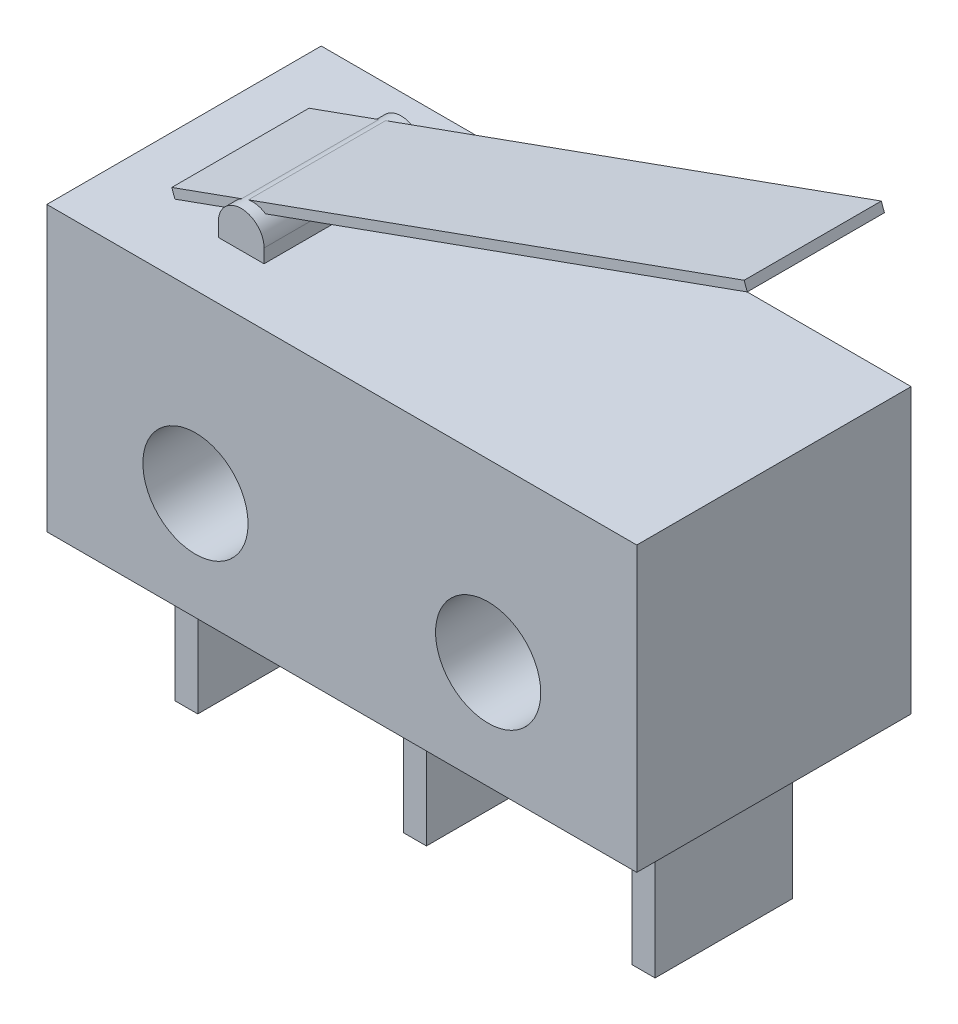
ISO-10303-21;
HEADER;
FILE_DESCRIPTION(('STEP AP214'),'2;1');
FILE_NAME('part.step','',(''),(''),'','','');
FILE_SCHEMA(('AUTOMOTIVE_DESIGN { 1 0 10303 214 1 1 1 1 }'));
ENDSEC;
DATA;
#1=APPLICATION_CONTEXT('core data for automotive mechanical design processes');
#2=APPLICATION_PROTOCOL_DEFINITION('international standard','automotive_design',2000,#1);
#3=PRODUCT_CONTEXT('',#1,'mechanical');
#4=PRODUCT('Part','Part','',(#3));
#5=PRODUCT_RELATED_PRODUCT_CATEGORY('part','',(#4));
#6=PRODUCT_DEFINITION_FORMATION('','',#4);
#7=PRODUCT_DEFINITION_CONTEXT('part definition',#1,'design');
#8=PRODUCT_DEFINITION('design','',#6,#7);
#9=PRODUCT_DEFINITION_SHAPE('','',#8);
#10=(LENGTH_UNIT() NAMED_UNIT(*) SI_UNIT(.MILLI.,.METRE.));
#11=(NAMED_UNIT(*) PLANE_ANGLE_UNIT() SI_UNIT($,.RADIAN.));
#12=(NAMED_UNIT(*) SI_UNIT($,.STERADIAN.) SOLID_ANGLE_UNIT());
#13=UNCERTAINTY_MEASURE_WITH_UNIT(LENGTH_MEASURE(1.E-05),#10,'distance_accuracy_value','');
#14=(GEOMETRIC_REPRESENTATION_CONTEXT(3) GLOBAL_UNCERTAINTY_ASSIGNED_CONTEXT((#13)) GLOBAL_UNIT_ASSIGNED_CONTEXT((#10,
#11,#12)) REPRESENTATION_CONTEXT('',''));
#15=CARTESIAN_POINT('',(0.,0.,0.));
#16=DIRECTION('',(0.,0.,1.));
#17=DIRECTION('',(1.,0.,0.));
#18=AXIS2_PLACEMENT_3D('',#15,#16,#17);
#19=CARTESIAN_POINT('',(-11.6,6.2,4.5));
#20=DIRECTION('',(0.941021825393203,0.338345864661656,0.));
#21=DIRECTION('',(-0.338345864661656,0.941021825393203,0.));
#22=AXIS2_PLACEMENT_3D('',#19,#20,#21);
#23=PLANE('',#22);
#24=DIRECTION('',(0.338345864661656,-0.941021825393203,0.));
#25=VECTOR('',#24,1.);
#26=CARTESIAN_POINT('',(-11.6,6.2,1.5));
#27=LINE('',#26,#25);
#28=CARTESIAN_POINT('',(-11.6676691729323,6.38820436507864,1.5));
#29=VERTEX_POINT('',#28);
#30=CARTESIAN_POINT('',(-11.6,6.2,1.5));
#31=VERTEX_POINT('',#30);
#32=EDGE_CURVE('E110',#29,#31,#27,.T.);
#33=ORIENTED_EDGE('',*,*,#32,.T.);
#34=DIRECTION('',(0.,0.,-1.));
#35=VECTOR('',#34,1.);
#36=CARTESIAN_POINT('',(-11.6,6.2,4.5));
#37=LINE('',#36,#35);
#38=CARTESIAN_POINT('',(-11.6,6.2,4.5));
#39=VERTEX_POINT('',#38);
#40=EDGE_CURVE('E12',#39,#31,#37,.T.);
#41=ORIENTED_EDGE('',*,*,#40,.F.);
#42=DIRECTION('',(0.338345864661656,-0.941021825393203,0.));
#43=VECTOR('',#42,1.);
#44=CARTESIAN_POINT('',(-11.6,6.2,4.5));
#45=LINE('',#44,#43);
#46=CARTESIAN_POINT('',(-11.6676691729323,6.38820436507864,4.5));
#47=VERTEX_POINT('',#46);
#48=EDGE_CURVE('E98',#47,#39,#45,.T.);
#49=ORIENTED_EDGE('',*,*,#48,.F.);
#50=DIRECTION('',(0.,0.,-1.));
#51=VECTOR('',#50,1.);
#52=CARTESIAN_POINT('',(-11.6676691729323,6.38820436507864,4.5));
#53=LINE('',#52,#51);
#54=EDGE_CURVE('E106',#47,#29,#53,.T.);
#55=ORIENTED_EDGE('',*,*,#54,.T.);
#56=EDGE_LOOP('',(#33,#41,#49,#55));
#57=FACE_BOUND('',#56,.T.);
#58=ADVANCED_FACE('F47',(#57),#23,.F.);
#59=CARTESIAN_POINT('',(-11.6,6.2,4.5));
#60=DIRECTION('',(-0.338345864661654,0.941021825393204,0.));
#61=DIRECTION('',(-0.941021825393204,-0.338345864661654,0.));
#62=AXIS2_PLACEMENT_3D('',#59,#60,#61);
#63=PLANE('',#62);
#64=DIRECTION('',(0.941021825393204,0.338345864661654,0.));
#65=VECTOR('',#64,1.);
#66=CARTESIAN_POINT('',(-11.6,6.2,1.5));
#67=LINE('',#66,#65);
#68=CARTESIAN_POINT('',(0.915590277729614,10.7,1.5));
#69=VERTEX_POINT('',#68);
#70=EDGE_CURVE('E102',#31,#69,#67,.T.);
#71=ORIENTED_EDGE('',*,*,#70,.T.);
#72=DIRECTION('',(0.,0.,-1.));
#73=VECTOR('',#72,1.);
#74=CARTESIAN_POINT('',(0.915590277729614,10.7,4.5));
#75=LINE('',#74,#73);
#76=CARTESIAN_POINT('',(0.915590277729614,10.7,4.5));
#77=VERTEX_POINT('',#76);
#78=EDGE_CURVE('E55',#77,#69,#75,.T.);
#79=ORIENTED_EDGE('',*,*,#78,.F.);
#80=DIRECTION('',(0.941021825393204,0.338345864661654,0.));
#81=VECTOR('',#80,1.);
#82=CARTESIAN_POINT('',(-11.6,6.2,4.5));
#83=LINE('',#82,#81);
#84=EDGE_CURVE('E93',#39,#77,#83,.T.);
#85=ORIENTED_EDGE('',*,*,#84,.F.);
#86=ORIENTED_EDGE('',*,*,#40,.T.);
#87=EDGE_LOOP('',(#71,#79,#85,#86));
#88=FACE_BOUND('',#87,.T.);
#89=ADVANCED_FACE('F101',(#88),#63,.F.);
#90=CARTESIAN_POINT('',(0.847921104797283,10.8882043650786,4.5));
#91=DIRECTION('',(-0.941021825393204,-0.338345864661655,0.));
#92=DIRECTION('',(0.338345864661655,-0.941021825393204,0.));
#93=AXIS2_PLACEMENT_3D('',#90,#91,#92);
#94=PLANE('',#93);
#95=DIRECTION('',(-0.338345864661655,0.941021825393204,0.));
#96=VECTOR('',#95,1.);
#97=CARTESIAN_POINT('',(0.847921104797283,10.8882043650786,1.5));
#98=LINE('',#97,#96);
#99=CARTESIAN_POINT('',(0.847921104797283,10.8882043650786,1.5));
#100=VERTEX_POINT('',#99);
#101=EDGE_CURVE('E80',#69,#100,#98,.T.);
#102=ORIENTED_EDGE('',*,*,#101,.T.);
#103=DIRECTION('',(0.,0.,-1.));
#104=VECTOR('',#103,1.);
#105=CARTESIAN_POINT('',(0.847921104797283,10.8882043650786,4.5));
#106=LINE('',#105,#104);
#107=CARTESIAN_POINT('',(0.847921104797283,10.8882043650786,4.5));
#108=VERTEX_POINT('',#107);
#109=EDGE_CURVE('E103',#108,#100,#106,.T.);
#110=ORIENTED_EDGE('',*,*,#109,.F.);
#111=DIRECTION('',(-0.338345864661655,0.941021825393204,0.));
#112=VECTOR('',#111,1.);
#113=CARTESIAN_POINT('',(0.847921104797283,10.8882043650786,4.5));
#114=LINE('',#113,#112);
#115=EDGE_CURVE('E96',#77,#108,#114,.T.);
#116=ORIENTED_EDGE('',*,*,#115,.F.);
#117=ORIENTED_EDGE('',*,*,#78,.T.);
#118=EDGE_LOOP('',(#102,#110,#116,#117));
#119=FACE_BOUND('',#118,.T.);
#120=ADVANCED_FACE('F104',(#119),#94,.F.);
#121=CARTESIAN_POINT('',(-11.6676691729323,6.38820436507864,4.5));
#122=DIRECTION('',(0.338345864661654,-0.941021825393204,0.));
#123=DIRECTION('',(0.941021825393204,0.338345864661654,0.));
#124=AXIS2_PLACEMENT_3D('',#121,#122,#123);
#125=PLANE('',#124);
#126=DIRECTION('',(-0.941021825393204,-0.338345864661654,0.));
#127=VECTOR('',#126,1.);
#128=CARTESIAN_POINT('',(-11.6676691729323,6.38820436507864,1.5));
#129=LINE('',#128,#127);
#130=EDGE_CURVE('E86',#100,#29,#129,.T.);
#131=ORIENTED_EDGE('',*,*,#130,.T.);
#132=ORIENTED_EDGE('',*,*,#54,.F.);
#133=DIRECTION('',(-0.941021825393204,-0.338345864661654,0.));
#134=VECTOR('',#133,1.);
#135=CARTESIAN_POINT('',(-11.6676691729323,6.38820436507864,4.5));
#136=LINE('',#135,#134);
#137=EDGE_CURVE('E63',#108,#47,#136,.T.);
#138=ORIENTED_EDGE('',*,*,#137,.F.);
#139=ORIENTED_EDGE('',*,*,#109,.T.);
#140=EDGE_LOOP('',(#131,#132,#138,#139));
#141=FACE_BOUND('',#140,.T.);
#142=ADVANCED_FACE('F117',(#141),#125,.F.);
#143=CARTESIAN_POINT('',(0.,0.,4.5));
#144=DIRECTION('',(0.,0.,-1.));
#145=DIRECTION('',(-1.,0.,0.));
#146=AXIS2_PLACEMENT_3D('',#143,#144,#145);
#147=PLANE('',#146);
#148=ORIENTED_EDGE('',*,*,#48,.T.);
#149=ORIENTED_EDGE('',*,*,#84,.T.);
#150=ORIENTED_EDGE('',*,*,#115,.T.);
#151=ORIENTED_EDGE('',*,*,#137,.T.);
#152=EDGE_LOOP('',(#148,#149,#150,#151));
#153=FACE_BOUND('',#152,.T.);
#154=ADVANCED_FACE('F94',(#153),#147,.F.);
#155=CARTESIAN_POINT('',(0.,0.,1.5));
#156=DIRECTION('',(0.,0.,-1.));
#157=DIRECTION('',(-1.,0.,0.));
#158=AXIS2_PLACEMENT_3D('',#155,#156,#157);
#159=PLANE('',#158);
#160=ORIENTED_EDGE('',*,*,#32,.F.);
#161=ORIENTED_EDGE('',*,*,#130,.F.);
#162=ORIENTED_EDGE('',*,*,#101,.F.);
#163=ORIENTED_EDGE('',*,*,#70,.F.);
#164=EDGE_LOOP('',(#160,#161,#162,#163));
#165=FACE_BOUND('',#164,.T.);
#166=ADVANCED_FACE('F120',(#165),#159,.T.);
#167=CLOSED_SHELL('',(#58,#89,#120,#142,#154,#166));
#168=MANIFOLD_SOLID_BREP('B2',#167);
#169=CARTESIAN_POINT('',(-12.9,0.,6.));
#170=DIRECTION('',(0.,1.,0.));
#171=DIRECTION('',(0.,0.,1.));
#172=AXIS2_PLACEMENT_3D('',#169,#170,#171);
#173=PLANE('',#172);
#174=DIRECTION('',(0.,0.,1.));
#175=VECTOR('',#174,1.);
#176=CARTESIAN_POINT('',(-6.1,0.,4.5));
#177=LINE('',#176,#175);
#178=CARTESIAN_POINT('',(-6.1,0.,1.5));
#179=VERTEX_POINT('',#178);
#180=CARTESIAN_POINT('',(-6.1,0.,4.5));
#181=VERTEX_POINT('',#180);
#182=EDGE_CURVE('E372',#179,#181,#177,.T.);
#183=ORIENTED_EDGE('',*,*,#182,.F.);
#184=DIRECTION('',(1.,0.,0.));
#185=VECTOR('',#184,1.);
#186=CARTESIAN_POINT('',(-6.1,0.,1.5));
#187=LINE('',#186,#185);
#188=CARTESIAN_POINT('',(-6.6,0.,1.5));
#189=VERTEX_POINT('',#188);
#190=EDGE_CURVE('E362',#189,#179,#187,.T.);
#191=ORIENTED_EDGE('',*,*,#190,.F.);
#192=DIRECTION('',(0.,0.,-1.));
#193=VECTOR('',#192,1.);
#194=CARTESIAN_POINT('',(-6.6,0.,4.5));
#195=LINE('',#194,#193);
#196=CARTESIAN_POINT('',(-6.6,0.,4.5));
#197=VERTEX_POINT('',#196);
#198=EDGE_CURVE('E365',#197,#189,#195,.T.);
#199=ORIENTED_EDGE('',*,*,#198,.F.);
#200=DIRECTION('',(-1.,0.,0.));
#201=VECTOR('',#200,1.);
#202=CARTESIAN_POINT('',(-6.1,0.,4.5));
#203=LINE('',#202,#201);
#204=EDGE_CURVE('E369',#181,#197,#203,.T.);
#205=ORIENTED_EDGE('',*,*,#204,.F.);
#206=EDGE_LOOP('',(#183,#191,#199,#205));
#207=FACE_BOUND('',#206,.T.);
#208=DIRECTION('',(1.,0.,0.));
#209=VECTOR('',#208,1.);
#210=CARTESIAN_POINT('',(-12.9,0.,0.));
#211=LINE('',#210,#209);
#212=CARTESIAN_POINT('',(-12.9,0.,0.));
#213=VERTEX_POINT('',#212);
#214=CARTESIAN_POINT('',(0.,0.,0.));
#215=VERTEX_POINT('',#214);
#216=EDGE_CURVE('E457',#213,#215,#211,.T.);
#217=ORIENTED_EDGE('',*,*,#216,.T.);
#218=DIRECTION('',(0.,0.,-1.));
#219=VECTOR('',#218,1.);
#220=CARTESIAN_POINT('',(0.,0.,6.));
#221=LINE('',#220,#219);
#222=CARTESIAN_POINT('',(0.,0.,6.));
#223=VERTEX_POINT('',#222);
#224=EDGE_CURVE('E45',#223,#215,#221,.T.);
#225=ORIENTED_EDGE('',*,*,#224,.F.);
#226=DIRECTION('',(1.,0.,0.));
#227=VECTOR('',#226,1.);
#228=CARTESIAN_POINT('',(-12.9,0.,6.));
#229=LINE('',#228,#227);
#230=CARTESIAN_POINT('',(-12.9,0.,6.));
#231=VERTEX_POINT('',#230);
#232=EDGE_CURVE('E458',#231,#223,#229,.T.);
#233=ORIENTED_EDGE('',*,*,#232,.F.);
#234=DIRECTION('',(0.,0.,-1.));
#235=VECTOR('',#234,1.);
#236=CARTESIAN_POINT('',(-12.9,0.,6.));
#237=LINE('',#236,#235);
#238=EDGE_CURVE('E468',#231,#213,#237,.T.);
#239=ORIENTED_EDGE('',*,*,#238,.T.);
#240=EDGE_LOOP('',(#217,#225,#233,#239));
#241=FACE_BOUND('',#240,.T.);
#242=DIRECTION('',(0.,0.,1.));
#243=VECTOR('',#242,1.);
#244=CARTESIAN_POINT('',(-1.1,0.,4.5));
#245=LINE('',#244,#243);
#246=CARTESIAN_POINT('',(-1.1,0.,1.5));
#247=VERTEX_POINT('',#246);
#248=CARTESIAN_POINT('',(-1.1,0.,4.5));
#249=VERTEX_POINT('',#248);
#250=EDGE_CURVE('E375',#247,#249,#245,.T.);
#251=ORIENTED_EDGE('',*,*,#250,.F.);
#252=DIRECTION('',(1.,0.,0.));
#253=VECTOR('',#252,1.);
#254=CARTESIAN_POINT('',(-1.1,0.,1.5));
#255=LINE('',#254,#253);
#256=CARTESIAN_POINT('',(-1.6,0.,1.5));
#257=VERTEX_POINT('',#256);
#258=EDGE_CURVE('E387',#257,#247,#255,.T.);
#259=ORIENTED_EDGE('',*,*,#258,.F.);
#260=DIRECTION('',(0.,0.,-1.));
#261=VECTOR('',#260,1.);
#262=CARTESIAN_POINT('',(-1.6,0.,4.5));
#263=LINE('',#262,#261);
#264=CARTESIAN_POINT('',(-1.6,0.,4.5));
#265=VERTEX_POINT('',#264);
#266=EDGE_CURVE('E399',#265,#257,#263,.T.);
#267=ORIENTED_EDGE('',*,*,#266,.F.);
#268=DIRECTION('',(-1.,0.,0.));
#269=VECTOR('',#268,1.);
#270=CARTESIAN_POINT('',(-1.1,0.,4.5));
#271=LINE('',#270,#269);
#272=EDGE_CURVE('E396',#249,#265,#271,.T.);
#273=ORIENTED_EDGE('',*,*,#272,.F.);
#274=EDGE_LOOP('',(#251,#259,#267,#273));
#275=FACE_BOUND('',#274,.T.);
#276=DIRECTION('',(0.,0.,1.));
#277=VECTOR('',#276,1.);
#278=CARTESIAN_POINT('',(-11.1,0.,4.5));
#279=LINE('',#278,#277);
#280=CARTESIAN_POINT('',(-11.1,0.,1.5));
#281=VERTEX_POINT('',#280);
#282=CARTESIAN_POINT('',(-11.1,0.,4.5));
#283=VERTEX_POINT('',#282);
#284=EDGE_CURVE('E315',#281,#283,#279,.T.);
#285=ORIENTED_EDGE('',*,*,#284,.F.);
#286=DIRECTION('',(1.,0.,0.));
#287=VECTOR('',#286,1.);
#288=CARTESIAN_POINT('',(-11.1,0.,1.5));
#289=LINE('',#288,#287);
#290=CARTESIAN_POINT('',(-11.6,0.,1.5));
#291=VERTEX_POINT('',#290);
#292=EDGE_CURVE('E317',#291,#281,#289,.T.);
#293=ORIENTED_EDGE('',*,*,#292,.F.);
#294=DIRECTION('',(0.,0.,-1.));
#295=VECTOR('',#294,1.);
#296=CARTESIAN_POINT('',(-11.6,0.,4.5));
#297=LINE('',#296,#295);
#298=CARTESIAN_POINT('',(-11.6,0.,4.5));
#299=VERTEX_POINT('',#298);
#300=EDGE_CURVE('E202',#299,#291,#297,.T.);
#301=ORIENTED_EDGE('',*,*,#300,.F.);
#302=DIRECTION('',(-1.,0.,0.));
#303=VECTOR('',#302,1.);
#304=CARTESIAN_POINT('',(-11.1,0.,4.5));
#305=LINE('',#304,#303);
#306=EDGE_CURVE('E197',#283,#299,#305,.T.);
#307=ORIENTED_EDGE('',*,*,#306,.F.);
#308=EDGE_LOOP('',(#285,#293,#301,#307));
#309=FACE_BOUND('',#308,.T.);
#310=ADVANCED_FACE('F183',(#207,#241,#275,#309),#173,.F.);
#311=CARTESIAN_POINT('',(0.,0.,6.));
#312=DIRECTION('',(-1.,0.,0.));
#313=DIRECTION('',(0.,0.,1.));
#314=AXIS2_PLACEMENT_3D('',#311,#312,#313);
#315=PLANE('',#314);
#316=DIRECTION('',(0.,1.,0.));
#317=VECTOR('',#316,1.);
#318=CARTESIAN_POINT('',(0.,0.,0.));
#319=LINE('',#318,#317);
#320=CARTESIAN_POINT('',(0.,6.2,0.));
#321=VERTEX_POINT('',#320);
#322=EDGE_CURVE('E471',#215,#321,#319,.T.);
#323=ORIENTED_EDGE('',*,*,#322,.T.);
#324=DIRECTION('',(0.,0.,-1.));
#325=VECTOR('',#324,1.);
#326=CARTESIAN_POINT('',(0.,6.2,6.));
#327=LINE('',#326,#325);
#328=CARTESIAN_POINT('',(0.,6.2,6.));
#329=VERTEX_POINT('',#328);
#330=EDGE_CURVE('E190',#329,#321,#327,.T.);
#331=ORIENTED_EDGE('',*,*,#330,.F.);
#332=DIRECTION('',(0.,1.,0.));
#333=VECTOR('',#332,1.);
#334=CARTESIAN_POINT('',(0.,0.,6.));
#335=LINE('',#334,#333);
#336=EDGE_CURVE('E461',#223,#329,#335,.T.);
#337=ORIENTED_EDGE('',*,*,#336,.F.);
#338=ORIENTED_EDGE('',*,*,#224,.T.);
#339=EDGE_LOOP('',(#323,#331,#337,#338));
#340=FACE_BOUND('',#339,.T.);
#341=ADVANCED_FACE('F502',(#340),#315,.F.);
#342=CARTESIAN_POINT('',(-12.9,6.2,6.));
#343=DIRECTION('',(0.,-1.,0.));
#344=DIRECTION('',(0.,0.,-1.));
#345=AXIS2_PLACEMENT_3D('',#342,#343,#344);
#346=PLANE('',#345);
#347=DIRECTION('',(0.,0.,-1.));
#348=VECTOR('',#347,1.);
#349=CARTESIAN_POINT('',(-9.4,6.2,4.75));
#350=LINE('',#349,#348);
#351=CARTESIAN_POINT('',(-9.4,6.2,4.75));
#352=VERTEX_POINT('',#351);
#353=CARTESIAN_POINT('',(-9.4,6.2,1.25));
#354=VERTEX_POINT('',#353);
#355=EDGE_CURVE('E452',#352,#354,#350,.T.);
#356=ORIENTED_EDGE('',*,*,#355,.F.);
#357=DIRECTION('',(1.,0.,0.));
#358=VECTOR('',#357,1.);
#359=CARTESIAN_POINT('',(-10.4,6.2,4.75));
#360=LINE('',#359,#358);
#361=CARTESIAN_POINT('',(-10.4,6.2,4.75));
#362=VERTEX_POINT('',#361);
#363=EDGE_CURVE('E431',#362,#352,#360,.T.);
#364=ORIENTED_EDGE('',*,*,#363,.F.);
#365=DIRECTION('',(0.,0.,-1.));
#366=VECTOR('',#365,1.);
#367=CARTESIAN_POINT('',(-10.4,6.2,4.75));
#368=LINE('',#367,#366);
#369=CARTESIAN_POINT('',(-10.4,6.2,1.25));
#370=VERTEX_POINT('',#369);
#371=EDGE_CURVE('E455',#362,#370,#368,.T.);
#372=ORIENTED_EDGE('',*,*,#371,.T.);
#373=DIRECTION('',(1.,0.,0.));
#374=VECTOR('',#373,1.);
#375=CARTESIAN_POINT('',(-10.4,6.2,1.25));
#376=LINE('',#375,#374);
#377=EDGE_CURVE('E442',#370,#354,#376,.T.);
#378=ORIENTED_EDGE('',*,*,#377,.T.);
#379=EDGE_LOOP('',(#356,#364,#372,#378));
#380=FACE_BOUND('',#379,.T.);
#381=DIRECTION('',(-1.,0.,0.));
#382=VECTOR('',#381,1.);
#383=CARTESIAN_POINT('',(-12.9,6.2,0.));
#384=LINE('',#383,#382);
#385=CARTESIAN_POINT('',(-12.9,6.2,0.));
#386=VERTEX_POINT('',#385);
#387=EDGE_CURVE('E473',#321,#386,#384,.T.);
#388=ORIENTED_EDGE('',*,*,#387,.T.);
#389=DIRECTION('',(0.,0.,-1.));
#390=VECTOR('',#389,1.);
#391=CARTESIAN_POINT('',(-12.9,6.2,6.));
#392=LINE('',#391,#390);
#393=CARTESIAN_POINT('',(-12.9,6.2,6.));
#394=VERTEX_POINT('',#393);
#395=EDGE_CURVE('E478',#394,#386,#392,.T.);
#396=ORIENTED_EDGE('',*,*,#395,.F.);
#397=DIRECTION('',(-1.,0.,0.));
#398=VECTOR('',#397,1.);
#399=CARTESIAN_POINT('',(-12.9,6.2,6.));
#400=LINE('',#399,#398);
#401=EDGE_CURVE('E464',#329,#394,#400,.T.);
#402=ORIENTED_EDGE('',*,*,#401,.F.);
#403=ORIENTED_EDGE('',*,*,#330,.T.);
#404=EDGE_LOOP('',(#388,#396,#402,#403));
#405=FACE_BOUND('',#404,.T.);
#406=ADVANCED_FACE('F485',(#380,#405),#346,.F.);
#407=CARTESIAN_POINT('',(-12.9,6.2,6.));
#408=DIRECTION('',(1.,0.,0.));
#409=DIRECTION('',(0.,0.,-1.));
#410=AXIS2_PLACEMENT_3D('',#407,#408,#409);
#411=PLANE('',#410);
#412=DIRECTION('',(0.,-1.,0.));
#413=VECTOR('',#412,1.);
#414=CARTESIAN_POINT('',(-12.9,6.2,0.));
#415=LINE('',#414,#413);
#416=EDGE_CURVE('E462',#386,#213,#415,.T.);
#417=ORIENTED_EDGE('',*,*,#416,.T.);
#418=ORIENTED_EDGE('',*,*,#238,.F.);
#419=DIRECTION('',(0.,-1.,0.));
#420=VECTOR('',#419,1.);
#421=CARTESIAN_POINT('',(-12.9,6.2,6.));
#422=LINE('',#421,#420);
#423=EDGE_CURVE('E466',#394,#231,#422,.T.);
#424=ORIENTED_EDGE('',*,*,#423,.F.);
#425=ORIENTED_EDGE('',*,*,#395,.T.);
#426=EDGE_LOOP('',(#417,#418,#424,#425));
#427=FACE_BOUND('',#426,.T.);
#428=ADVANCED_FACE('F494',(#427),#411,.F.);
#429=CARTESIAN_POINT('',(0.,0.,6.));
#430=DIRECTION('',(0.,0.,1.));
#431=DIRECTION('',(1.,0.,0.));
#432=AXIS2_PLACEMENT_3D('',#429,#430,#431);
#433=PLANE('',#432);
#434=CARTESIAN_POINT('',(-3.25,2.35,6.));
#435=DIRECTION('',(0.,0.,1.));
#436=DIRECTION('',(1.,0.,0.));
#437=AXIS2_PLACEMENT_3D('',#434,#435,#436);
#438=CIRCLE('',#437,1.15);
#439=CARTESIAN_POINT('',(-2.1,2.35,6.));
#440=VERTEX_POINT('',#439);
#441=EDGE_CURVE('E416',#440,#440,#438,.T.);
#442=ORIENTED_EDGE('',*,*,#441,.F.);
#443=EDGE_LOOP('',(#442));
#444=FACE_BOUND('',#443,.T.);
#445=CARTESIAN_POINT('',(-9.65,2.35,6.));
#446=DIRECTION('',(0.,0.,1.));
#447=DIRECTION('',(1.,0.,0.));
#448=AXIS2_PLACEMENT_3D('',#445,#446,#447);
#449=CIRCLE('',#448,1.15);
#450=CARTESIAN_POINT('',(-8.5,2.35,6.));
#451=VERTEX_POINT('',#450);
#452=EDGE_CURVE('E420',#451,#451,#449,.T.);
#453=ORIENTED_EDGE('',*,*,#452,.F.);
#454=EDGE_LOOP('',(#453));
#455=FACE_BOUND('',#454,.T.);
#456=ORIENTED_EDGE('',*,*,#232,.T.);
#457=ORIENTED_EDGE('',*,*,#336,.T.);
#458=ORIENTED_EDGE('',*,*,#401,.T.);
#459=ORIENTED_EDGE('',*,*,#423,.T.);
#460=EDGE_LOOP('',(#456,#457,#458,#459));
#461=FACE_BOUND('',#460,.T.);
#462=ADVANCED_FACE('F501',(#444,#455,#461),#433,.T.);
#463=CARTESIAN_POINT('',(0.,0.,0.));
#464=DIRECTION('',(0.,0.,1.));
#465=DIRECTION('',(1.,0.,0.));
#466=AXIS2_PLACEMENT_3D('',#463,#464,#465);
#467=PLANE('',#466);
#468=CARTESIAN_POINT('',(-3.25,2.35,0.));
#469=DIRECTION('',(0.,0.,1.));
#470=DIRECTION('',(1.,0.,0.));
#471=AXIS2_PLACEMENT_3D('',#468,#469,#470);
#472=CIRCLE('',#471,1.15);
#473=CARTESIAN_POINT('',(-2.1,2.35,0.));
#474=VERTEX_POINT('',#473);
#475=EDGE_CURVE('E419',#474,#474,#472,.T.);
#476=ORIENTED_EDGE('',*,*,#475,.T.);
#477=EDGE_LOOP('',(#476));
#478=FACE_BOUND('',#477,.T.);
#479=CARTESIAN_POINT('',(-9.65,2.35,0.));
#480=DIRECTION('',(0.,0.,1.));
#481=DIRECTION('',(1.,0.,0.));
#482=AXIS2_PLACEMENT_3D('',#479,#480,#481);
#483=CIRCLE('',#482,1.15);
#484=CARTESIAN_POINT('',(-8.5,2.35,0.));
#485=VERTEX_POINT('',#484);
#486=EDGE_CURVE('E415',#485,#485,#483,.T.);
#487=ORIENTED_EDGE('',*,*,#486,.T.);
#488=EDGE_LOOP('',(#487));
#489=FACE_BOUND('',#488,.T.);
#490=ORIENTED_EDGE('',*,*,#216,.F.);
#491=ORIENTED_EDGE('',*,*,#416,.F.);
#492=ORIENTED_EDGE('',*,*,#387,.F.);
#493=ORIENTED_EDGE('',*,*,#322,.F.);
#494=EDGE_LOOP('',(#490,#491,#492,#493));
#495=FACE_BOUND('',#494,.T.);
#496=ADVANCED_FACE('F491',(#478,#489,#495),#467,.F.);
#497=CARTESIAN_POINT('',(-10.4,6.2,4.75));
#498=DIRECTION('',(1.,0.,0.));
#499=DIRECTION('',(0.,0.,-1.));
#500=AXIS2_PLACEMENT_3D('',#497,#498,#499);
#501=PLANE('',#500);
#502=DIRECTION('',(0.,-1.,0.));
#503=VECTOR('',#502,1.);
#504=CARTESIAN_POINT('',(-10.4,6.2,1.25));
#505=LINE('',#504,#503);
#506=CARTESIAN_POINT('',(-10.4,6.5,1.25));
#507=VERTEX_POINT('',#506);
#508=EDGE_CURVE('E423',#507,#370,#505,.T.);
#509=ORIENTED_EDGE('',*,*,#508,.T.);
#510=ORIENTED_EDGE('',*,*,#371,.F.);
#511=DIRECTION('',(0.,-1.,0.));
#512=VECTOR('',#511,1.);
#513=CARTESIAN_POINT('',(-10.4,6.2,4.75));
#514=LINE('',#513,#512);
#515=CARTESIAN_POINT('',(-10.4,6.5,4.75));
#516=VERTEX_POINT('',#515);
#517=EDGE_CURVE('E428',#516,#362,#514,.T.);
#518=ORIENTED_EDGE('',*,*,#517,.F.);
#519=DIRECTION('',(0.,0.,-1.));
#520=VECTOR('',#519,1.);
#521=CARTESIAN_POINT('',(-10.4,6.5,4.75));
#522=LINE('',#521,#520);
#523=EDGE_CURVE('E439',#516,#507,#522,.T.);
#524=ORIENTED_EDGE('',*,*,#523,.T.);
#525=EDGE_LOOP('',(#509,#510,#518,#524));
#526=FACE_BOUND('',#525,.T.);
#527=ADVANCED_FACE('F516',(#526),#501,.F.);
#528=CARTESIAN_POINT('',(-9.4,6.5,4.75));
#529=DIRECTION('',(-1.,0.,0.));
#530=DIRECTION('',(0.,-1.,0.));
#531=AXIS2_PLACEMENT_3D('',#528,#529,#530);
#532=PLANE('',#531);
#533=DIRECTION('',(0.,1.,0.));
#534=VECTOR('',#533,1.);
#535=CARTESIAN_POINT('',(-9.4,6.5,1.25));
#536=LINE('',#535,#534);
#537=CARTESIAN_POINT('',(-9.4,6.5,1.25));
#538=VERTEX_POINT('',#537);
#539=EDGE_CURVE('E444',#354,#538,#536,.T.);
#540=ORIENTED_EDGE('',*,*,#539,.T.);
#541=DIRECTION('',(0.,0.,-1.));
#542=VECTOR('',#541,1.);
#543=CARTESIAN_POINT('',(-9.4,6.5,4.75));
#544=LINE('',#543,#542);
#545=CARTESIAN_POINT('',(-9.4,6.5,4.75));
#546=VERTEX_POINT('',#545);
#547=EDGE_CURVE('E449',#546,#538,#544,.T.);
#548=ORIENTED_EDGE('',*,*,#547,.F.);
#549=DIRECTION('',(0.,1.,0.));
#550=VECTOR('',#549,1.);
#551=CARTESIAN_POINT('',(-9.4,6.5,4.75));
#552=LINE('',#551,#550);
#553=EDGE_CURVE('E435',#352,#546,#552,.T.);
#554=ORIENTED_EDGE('',*,*,#553,.F.);
#555=ORIENTED_EDGE('',*,*,#355,.T.);
#556=EDGE_LOOP('',(#540,#548,#554,#555));
#557=FACE_BOUND('',#556,.T.);
#558=ADVANCED_FACE('F523',(#557),#532,.F.);
#559=CARTESIAN_POINT('',(-9.9,6.5,4.75));
#560=DIRECTION('',(0.,0.,-1.));
#561=DIRECTION('',(-1.,0.,0.));
#562=AXIS2_PLACEMENT_3D('',#559,#560,#561);
#563=CYLINDRICAL_SURFACE('',#562,0.5);
#564=CARTESIAN_POINT('',(-9.9,6.5,1.25));
#565=DIRECTION('',(0.,0.,1.));
#566=DIRECTION('',(1.,0.,0.));
#567=AXIS2_PLACEMENT_3D('',#564,#565,#566);
#568=CIRCLE('',#567,0.5);
#569=EDGE_CURVE('E432',#538,#507,#568,.T.);
#570=ORIENTED_EDGE('',*,*,#569,.T.);
#571=ORIENTED_EDGE('',*,*,#523,.F.);
#572=CARTESIAN_POINT('',(-9.9,6.5,4.75));
#573=DIRECTION('',(0.,0.,1.));
#574=DIRECTION('',(1.,0.,0.));
#575=AXIS2_PLACEMENT_3D('',#572,#573,#574);
#576=CIRCLE('',#575,0.5);
#577=EDGE_CURVE('E437',#546,#516,#576,.T.);
#578=ORIENTED_EDGE('',*,*,#577,.F.);
#579=ORIENTED_EDGE('',*,*,#547,.T.);
#580=EDGE_LOOP('',(#570,#571,#578,#579));
#581=FACE_BOUND('',#580,.T.);
#582=ADVANCED_FACE('F527',(#581),#563,.T.);
#583=CARTESIAN_POINT('',(-9.9,6.5,4.75));
#584=DIRECTION('',(0.,0.,1.));
#585=DIRECTION('',(1.,0.,0.));
#586=AXIS2_PLACEMENT_3D('',#583,#584,#585);
#587=PLANE('',#586);
#588=ORIENTED_EDGE('',*,*,#517,.T.);
#589=ORIENTED_EDGE('',*,*,#363,.T.);
#590=ORIENTED_EDGE('',*,*,#553,.T.);
#591=ORIENTED_EDGE('',*,*,#577,.T.);
#592=EDGE_LOOP('',(#588,#589,#590,#591));
#593=FACE_BOUND('',#592,.T.);
#594=ADVANCED_FACE('F531',(#593),#587,.T.);
#595=CARTESIAN_POINT('',(-9.9,6.5,1.25));
#596=DIRECTION('',(0.,0.,1.));
#597=DIRECTION('',(1.,0.,0.));
#598=AXIS2_PLACEMENT_3D('',#595,#596,#597);
#599=PLANE('',#598);
#600=ORIENTED_EDGE('',*,*,#508,.F.);
#601=ORIENTED_EDGE('',*,*,#569,.F.);
#602=ORIENTED_EDGE('',*,*,#539,.F.);
#603=ORIENTED_EDGE('',*,*,#377,.F.);
#604=EDGE_LOOP('',(#600,#601,#602,#603));
#605=FACE_BOUND('',#604,.T.);
#606=ADVANCED_FACE('F533',(#605),#599,.F.);
#607=CARTESIAN_POINT('',(-9.65,2.35,0.));
#608=DIRECTION('',(0.,0.,1.));
#609=DIRECTION('',(1.,0.,0.));
#610=AXIS2_PLACEMENT_3D('',#607,#608,#609);
#611=CYLINDRICAL_SURFACE('',#610,1.15);
#612=ORIENTED_EDGE('',*,*,#486,.F.);
#613=EDGE_LOOP('',(#612));
#614=FACE_BOUND('',#613,.T.);
#615=ORIENTED_EDGE('',*,*,#452,.T.);
#616=EDGE_LOOP('',(#615));
#617=FACE_BOUND('',#616,.T.);
#618=ADVANCED_FACE('F536',(#614,#617),#611,.F.);
#619=CARTESIAN_POINT('',(-3.25,2.35,0.));
#620=DIRECTION('',(0.,0.,1.));
#621=DIRECTION('',(1.,0.,0.));
#622=AXIS2_PLACEMENT_3D('',#619,#620,#621);
#623=CYLINDRICAL_SURFACE('',#622,1.15);
#624=ORIENTED_EDGE('',*,*,#475,.F.);
#625=EDGE_LOOP('',(#624));
#626=FACE_BOUND('',#625,.T.);
#627=ORIENTED_EDGE('',*,*,#441,.T.);
#628=EDGE_LOOP('',(#627));
#629=FACE_BOUND('',#628,.T.);
#630=ADVANCED_FACE('F543',(#626,#629),#623,.F.);
#631=CARTESIAN_POINT('',(-1.1,-3.3,4.5));
#632=DIRECTION('',(-1.,0.,0.));
#633=DIRECTION('',(0.,0.,1.));
#634=AXIS2_PLACEMENT_3D('',#631,#632,#633);
#635=PLANE('',#634);
#636=ORIENTED_EDGE('',*,*,#250,.T.);
#637=DIRECTION('',(0.,1.,0.));
#638=VECTOR('',#637,1.);
#639=CARTESIAN_POINT('',(-1.1,-3.3,4.5));
#640=LINE('',#639,#638);
#641=CARTESIAN_POINT('',(-1.1,-3.3,4.5));
#642=VERTEX_POINT('',#641);
#643=EDGE_CURVE('E412',#642,#249,#640,.T.);
#644=ORIENTED_EDGE('',*,*,#643,.F.);
#645=DIRECTION('',(0.,0.,1.));
#646=VECTOR('',#645,1.);
#647=CARTESIAN_POINT('',(-1.1,-3.3,4.5));
#648=LINE('',#647,#646);
#649=CARTESIAN_POINT('',(-1.1,-3.3,1.5));
#650=VERTEX_POINT('',#649);
#651=EDGE_CURVE('E383',#650,#642,#648,.T.);
#652=ORIENTED_EDGE('',*,*,#651,.F.);
#653=DIRECTION('',(0.,1.,0.));
#654=VECTOR('',#653,1.);
#655=CARTESIAN_POINT('',(-1.1,-3.3,1.5));
#656=LINE('',#655,#654);
#657=EDGE_CURVE('E393',#650,#247,#656,.T.);
#658=ORIENTED_EDGE('',*,*,#657,.T.);
#659=EDGE_LOOP('',(#636,#644,#652,#658));
#660=FACE_BOUND('',#659,.T.);
#661=ADVANCED_FACE('F547',(#660),#635,.F.);
#662=CARTESIAN_POINT('',(-1.1,-3.3,4.5));
#663=DIRECTION('',(0.,0.,-1.));
#664=DIRECTION('',(-1.,0.,0.));
#665=AXIS2_PLACEMENT_3D('',#662,#663,#664);
#666=PLANE('',#665);
#667=ORIENTED_EDGE('',*,*,#272,.T.);
#668=DIRECTION('',(0.,1.,0.));
#669=VECTOR('',#668,1.);
#670=CARTESIAN_POINT('',(-1.6,-3.3,4.5));
#671=LINE('',#670,#669);
#672=CARTESIAN_POINT('',(-1.6,-3.3,4.5));
#673=VERTEX_POINT('',#672);
#674=EDGE_CURVE('E409',#673,#265,#671,.T.);
#675=ORIENTED_EDGE('',*,*,#674,.F.);
#676=DIRECTION('',(-1.,0.,0.));
#677=VECTOR('',#676,1.);
#678=CARTESIAN_POINT('',(-1.1,-3.3,4.5));
#679=LINE('',#678,#677);
#680=EDGE_CURVE('E386',#642,#673,#679,.T.);
#681=ORIENTED_EDGE('',*,*,#680,.F.);
#682=ORIENTED_EDGE('',*,*,#643,.T.);
#683=EDGE_LOOP('',(#667,#675,#681,#682));
#684=FACE_BOUND('',#683,.T.);
#685=ADVANCED_FACE('F551',(#684),#666,.F.);
#686=CARTESIAN_POINT('',(-1.6,-3.3,4.5));
#687=DIRECTION('',(1.,0.,0.));
#688=DIRECTION('',(0.,0.,-1.));
#689=AXIS2_PLACEMENT_3D('',#686,#687,#688);
#690=PLANE('',#689);
#691=ORIENTED_EDGE('',*,*,#266,.T.);
#692=DIRECTION('',(0.,1.,0.));
#693=VECTOR('',#692,1.);
#694=CARTESIAN_POINT('',(-1.6,-3.3,1.5));
#695=LINE('',#694,#693);
#696=CARTESIAN_POINT('',(-1.6,-3.3,1.5));
#697=VERTEX_POINT('',#696);
#698=EDGE_CURVE('E406',#697,#257,#695,.T.);
#699=ORIENTED_EDGE('',*,*,#698,.F.);
#700=DIRECTION('',(0.,0.,-1.));
#701=VECTOR('',#700,1.);
#702=CARTESIAN_POINT('',(-1.6,-3.3,4.5));
#703=LINE('',#702,#701);
#704=EDGE_CURVE('E389',#673,#697,#703,.T.);
#705=ORIENTED_EDGE('',*,*,#704,.F.);
#706=ORIENTED_EDGE('',*,*,#674,.T.);
#707=EDGE_LOOP('',(#691,#699,#705,#706));
#708=FACE_BOUND('',#707,.T.);
#709=ADVANCED_FACE('F555',(#708),#690,.F.);
#710=CARTESIAN_POINT('',(-1.1,-3.3,1.5));
#711=DIRECTION('',(0.,0.,1.));
#712=DIRECTION('',(1.,0.,0.));
#713=AXIS2_PLACEMENT_3D('',#710,#711,#712);
#714=PLANE('',#713);
#715=ORIENTED_EDGE('',*,*,#258,.T.);
#716=ORIENTED_EDGE('',*,*,#657,.F.);
#717=DIRECTION('',(1.,0.,0.));
#718=VECTOR('',#717,1.);
#719=CARTESIAN_POINT('',(-1.1,-3.3,1.5));
#720=LINE('',#719,#718);
#721=EDGE_CURVE('E391',#697,#650,#720,.T.);
#722=ORIENTED_EDGE('',*,*,#721,.F.);
#723=ORIENTED_EDGE('',*,*,#698,.T.);
#724=EDGE_LOOP('',(#715,#716,#722,#723));
#725=FACE_BOUND('',#724,.T.);
#726=ADVANCED_FACE('F559',(#725),#714,.F.);
#727=CARTESIAN_POINT('',(0.,-3.3,0.));
#728=DIRECTION('',(0.,1.,0.));
#729=DIRECTION('',(0.,0.,1.));
#730=AXIS2_PLACEMENT_3D('',#727,#728,#729);
#731=PLANE('',#730);
#732=ORIENTED_EDGE('',*,*,#651,.T.);
#733=ORIENTED_EDGE('',*,*,#680,.T.);
#734=ORIENTED_EDGE('',*,*,#704,.T.);
#735=ORIENTED_EDGE('',*,*,#721,.T.);
#736=EDGE_LOOP('',(#732,#733,#734,#735));
#737=FACE_BOUND('',#736,.T.);
#738=ADVANCED_FACE('F563',(#737),#731,.F.);
#739=CARTESIAN_POINT('',(-6.1,-3.3,4.5));
#740=DIRECTION('',(-1.,0.,0.));
#741=DIRECTION('',(0.,0.,1.));
#742=AXIS2_PLACEMENT_3D('',#739,#740,#741);
#743=PLANE('',#742);
#744=ORIENTED_EDGE('',*,*,#182,.T.);
#745=DIRECTION('',(0.,1.,0.));
#746=VECTOR('',#745,1.);
#747=CARTESIAN_POINT('',(-6.1,-3.3,4.5));
#748=LINE('',#747,#746);
#749=CARTESIAN_POINT('',(-6.1,-3.3,4.5));
#750=VERTEX_POINT('',#749);
#751=EDGE_CURVE('E321',#750,#181,#748,.T.);
#752=ORIENTED_EDGE('',*,*,#751,.F.);
#753=DIRECTION('',(0.,0.,1.));
#754=VECTOR('',#753,1.);
#755=CARTESIAN_POINT('',(-6.1,-3.3,4.5));
#756=LINE('',#755,#754);
#757=CARTESIAN_POINT('',(-6.1,-3.3,1.5));
#758=VERTEX_POINT('',#757);
#759=EDGE_CURVE('E366',#758,#750,#756,.T.);
#760=ORIENTED_EDGE('',*,*,#759,.F.);
#761=DIRECTION('',(0.,1.,0.));
#762=VECTOR('',#761,1.);
#763=CARTESIAN_POINT('',(-6.1,-3.3,1.5));
#764=LINE('',#763,#762);
#765=EDGE_CURVE('E358',#758,#179,#764,.T.);
#766=ORIENTED_EDGE('',*,*,#765,.T.);
#767=EDGE_LOOP('',(#744,#752,#760,#766));
#768=FACE_BOUND('',#767,.T.);
#769=ADVANCED_FACE('F567',(#768),#743,.F.);
#770=CARTESIAN_POINT('',(-6.1,-3.3,4.5));
#771=DIRECTION('',(0.,0.,-1.));
#772=DIRECTION('',(-1.,0.,0.));
#773=AXIS2_PLACEMENT_3D('',#770,#771,#772);
#774=PLANE('',#773);
#775=ORIENTED_EDGE('',*,*,#204,.T.);
#776=DIRECTION('',(0.,1.,0.));
#777=VECTOR('',#776,1.);
#778=CARTESIAN_POINT('',(-6.6,-3.3,4.5));
#779=LINE('',#778,#777);
#780=CARTESIAN_POINT('',(-6.6,-3.3,4.5));
#781=VERTEX_POINT('',#780);
#782=EDGE_CURVE('E352',#781,#197,#779,.T.);
#783=ORIENTED_EDGE('',*,*,#782,.F.);
#784=DIRECTION('',(-1.,0.,0.));
#785=VECTOR('',#784,1.);
#786=CARTESIAN_POINT('',(-6.1,-3.3,4.5));
#787=LINE('',#786,#785);
#788=EDGE_CURVE('E379',#750,#781,#787,.T.);
#789=ORIENTED_EDGE('',*,*,#788,.F.);
#790=ORIENTED_EDGE('',*,*,#751,.T.);
#791=EDGE_LOOP('',(#775,#783,#789,#790));
#792=FACE_BOUND('',#791,.T.);
#793=ADVANCED_FACE('F580',(#792),#774,.F.);
#794=CARTESIAN_POINT('',(-6.6,-3.3,4.5));
#795=DIRECTION('',(1.,0.,0.));
#796=DIRECTION('',(0.,0.,-1.));
#797=AXIS2_PLACEMENT_3D('',#794,#795,#796);
#798=PLANE('',#797);
#799=ORIENTED_EDGE('',*,*,#198,.T.);
#800=DIRECTION('',(0.,1.,0.));
#801=VECTOR('',#800,1.);
#802=CARTESIAN_POINT('',(-6.6,-3.3,1.5));
#803=LINE('',#802,#801);
#804=CARTESIAN_POINT('',(-6.6,-3.3,1.5));
#805=VERTEX_POINT('',#804);
#806=EDGE_CURVE('E355',#805,#189,#803,.T.);
#807=ORIENTED_EDGE('',*,*,#806,.F.);
#808=DIRECTION('',(0.,0.,-1.));
#809=VECTOR('',#808,1.);
#810=CARTESIAN_POINT('',(-6.6,-3.3,4.5));
#811=LINE('',#810,#809);
#812=EDGE_CURVE('E377',#781,#805,#811,.T.);
#813=ORIENTED_EDGE('',*,*,#812,.F.);
#814=ORIENTED_EDGE('',*,*,#782,.T.);
#815=EDGE_LOOP('',(#799,#807,#813,#814));
#816=FACE_BOUND('',#815,.T.);
#817=ADVANCED_FACE('F576',(#816),#798,.F.);
#818=CARTESIAN_POINT('',(-6.1,-3.3,1.5));
#819=DIRECTION('',(0.,0.,1.));
#820=DIRECTION('',(1.,0.,0.));
#821=AXIS2_PLACEMENT_3D('',#818,#819,#820);
#822=PLANE('',#821);
#823=ORIENTED_EDGE('',*,*,#190,.T.);
#824=ORIENTED_EDGE('',*,*,#765,.F.);
#825=DIRECTION('',(1.,0.,0.));
#826=VECTOR('',#825,1.);
#827=CARTESIAN_POINT('',(-6.1,-3.3,1.5));
#828=LINE('',#827,#826);
#829=EDGE_CURVE('E361',#805,#758,#828,.T.);
#830=ORIENTED_EDGE('',*,*,#829,.F.);
#831=ORIENTED_EDGE('',*,*,#806,.T.);
#832=EDGE_LOOP('',(#823,#824,#830,#831));
#833=FACE_BOUND('',#832,.T.);
#834=ADVANCED_FACE('F572',(#833),#822,.F.);
#835=CARTESIAN_POINT('',(0.,-3.3,0.));
#836=DIRECTION('',(0.,1.,0.));
#837=DIRECTION('',(0.,0.,1.));
#838=AXIS2_PLACEMENT_3D('',#835,#836,#837);
#839=PLANE('',#838);
#840=ORIENTED_EDGE('',*,*,#759,.T.);
#841=ORIENTED_EDGE('',*,*,#788,.T.);
#842=ORIENTED_EDGE('',*,*,#812,.T.);
#843=ORIENTED_EDGE('',*,*,#829,.T.);
#844=EDGE_LOOP('',(#840,#841,#842,#843));
#845=FACE_BOUND('',#844,.T.);
#846=ADVANCED_FACE('F569',(#845),#839,.F.);
#847=CARTESIAN_POINT('',(-11.1,-3.3,4.5));
#848=DIRECTION('',(-1.,0.,0.));
#849=DIRECTION('',(0.,0.,1.));
#850=AXIS2_PLACEMENT_3D('',#847,#848,#849);
#851=PLANE('',#850);
#852=ORIENTED_EDGE('',*,*,#284,.T.);
#853=DIRECTION('',(0.,1.,0.));
#854=VECTOR('',#853,1.);
#855=CARTESIAN_POINT('',(-11.1,-3.3,4.5));
#856=LINE('',#855,#854);
#857=CARTESIAN_POINT('',(-11.1,-3.3,4.5));
#858=VERTEX_POINT('',#857);
#859=EDGE_CURVE('E828',#858,#283,#856,.T.);
#860=ORIENTED_EDGE('',*,*,#859,.F.);
#861=DIRECTION('',(0.,0.,1.));
#862=VECTOR('',#861,1.);
#863=CARTESIAN_POINT('',(-11.1,-3.3,4.5));
#864=LINE('',#863,#862);
#865=CARTESIAN_POINT('',(-11.1,-3.3,1.5));
#866=VERTEX_POINT('',#865);
#867=EDGE_CURVE('E332',#866,#858,#864,.T.);
#868=ORIENTED_EDGE('',*,*,#867,.F.);
#869=DIRECTION('',(0.,1.,0.));
#870=VECTOR('',#869,1.);
#871=CARTESIAN_POINT('',(-11.1,-3.3,1.5));
#872=LINE('',#871,#870);
#873=EDGE_CURVE('E328',#866,#281,#872,.T.);
#874=ORIENTED_EDGE('',*,*,#873,.T.);
#875=EDGE_LOOP('',(#852,#860,#868,#874));
#876=FACE_BOUND('',#875,.T.);
#877=ADVANCED_FACE('F334',(#876),#851,.F.);
#878=CARTESIAN_POINT('',(-11.1,-3.3,4.5));
#879=DIRECTION('',(0.,0.,-1.));
#880=DIRECTION('',(-1.,0.,0.));
#881=AXIS2_PLACEMENT_3D('',#878,#879,#880);
#882=PLANE('',#881);
#883=ORIENTED_EDGE('',*,*,#306,.T.);
#884=DIRECTION('',(0.,1.,0.));
#885=VECTOR('',#884,1.);
#886=CARTESIAN_POINT('',(-11.6,-3.3,4.5));
#887=LINE('',#886,#885);
#888=CARTESIAN_POINT('',(-11.6,-3.3,4.5));
#889=VERTEX_POINT('',#888);
#890=EDGE_CURVE('E340',#889,#299,#887,.T.);
#891=ORIENTED_EDGE('',*,*,#890,.F.);
#892=DIRECTION('',(-1.,0.,0.));
#893=VECTOR('',#892,1.);
#894=CARTESIAN_POINT('',(-11.1,-3.3,4.5));
#895=LINE('',#894,#893);
#896=EDGE_CURVE('E347',#858,#889,#895,.T.);
#897=ORIENTED_EDGE('',*,*,#896,.F.);
#898=ORIENTED_EDGE('',*,*,#859,.T.);
#899=EDGE_LOOP('',(#883,#891,#897,#898));
#900=FACE_BOUND('',#899,.T.);
#901=ADVANCED_FACE('F597',(#900),#882,.F.);
#902=CARTESIAN_POINT('',(-11.6,-3.3,4.5));
#903=DIRECTION('',(1.,0.,0.));
#904=DIRECTION('',(0.,0.,-1.));
#905=AXIS2_PLACEMENT_3D('',#902,#903,#904);
#906=PLANE('',#905);
#907=ORIENTED_EDGE('',*,*,#300,.T.);
#908=DIRECTION('',(0.,1.,0.));
#909=VECTOR('',#908,1.);
#910=CARTESIAN_POINT('',(-11.6,-3.3,1.5));
#911=LINE('',#910,#909);
#912=CARTESIAN_POINT('',(-11.6,-3.3,1.5));
#913=VERTEX_POINT('',#912);
#914=EDGE_CURVE('E331',#913,#291,#911,.T.);
#915=ORIENTED_EDGE('',*,*,#914,.F.);
#916=DIRECTION('',(0.,0.,-1.));
#917=VECTOR('',#916,1.);
#918=CARTESIAN_POINT('',(-11.6,-3.3,4.5));
#919=LINE('',#918,#917);
#920=EDGE_CURVE('E338',#889,#913,#919,.T.);
#921=ORIENTED_EDGE('',*,*,#920,.F.);
#922=ORIENTED_EDGE('',*,*,#890,.T.);
#923=EDGE_LOOP('',(#907,#915,#921,#922));
#924=FACE_BOUND('',#923,.T.);
#925=ADVANCED_FACE('F594',(#924),#906,.F.);
#926=CARTESIAN_POINT('',(-11.1,-3.3,1.5));
#927=DIRECTION('',(0.,0.,1.));
#928=DIRECTION('',(1.,0.,0.));
#929=AXIS2_PLACEMENT_3D('',#926,#927,#928);
#930=PLANE('',#929);
#931=ORIENTED_EDGE('',*,*,#292,.T.);
#932=ORIENTED_EDGE('',*,*,#873,.F.);
#933=DIRECTION('',(1.,0.,0.));
#934=VECTOR('',#933,1.);
#935=CARTESIAN_POINT('',(-11.1,-3.3,1.5));
#936=LINE('',#935,#934);
#937=EDGE_CURVE('E336',#913,#866,#936,.T.);
#938=ORIENTED_EDGE('',*,*,#937,.F.);
#939=ORIENTED_EDGE('',*,*,#914,.T.);
#940=EDGE_LOOP('',(#931,#932,#938,#939));
#941=FACE_BOUND('',#940,.T.);
#942=ADVANCED_FACE('F326',(#941),#930,.F.);
#943=CARTESIAN_POINT('',(0.,-3.3,0.));
#944=DIRECTION('',(0.,1.,0.));
#945=DIRECTION('',(0.,0.,1.));
#946=AXIS2_PLACEMENT_3D('',#943,#944,#945);
#947=PLANE('',#946);
#948=ORIENTED_EDGE('',*,*,#867,.T.);
#949=ORIENTED_EDGE('',*,*,#896,.T.);
#950=ORIENTED_EDGE('',*,*,#920,.T.);
#951=ORIENTED_EDGE('',*,*,#937,.T.);
#952=EDGE_LOOP('',(#948,#949,#950,#951));
#953=FACE_BOUND('',#952,.T.);
#954=ADVANCED_FACE('F588',(#953),#947,.F.);
#955=CLOSED_SHELL('',(#310,#341,#406,#428,#462,#496,#527,#558,#582,#594,#606,#618,#630,#661,
#685,#709,#726,#738,#769,#793,#817,#834,#846,#877,#901,#925,#942,#954));
#956=MANIFOLD_SOLID_BREP('B6',#955);
#957=ADVANCED_BREP_SHAPE_REPRESENTATION('',(#18,#168,#956),#14);
#958=SHAPE_DEFINITION_REPRESENTATION(#9,#957);
ENDSEC;
END-ISO-10303-21;
